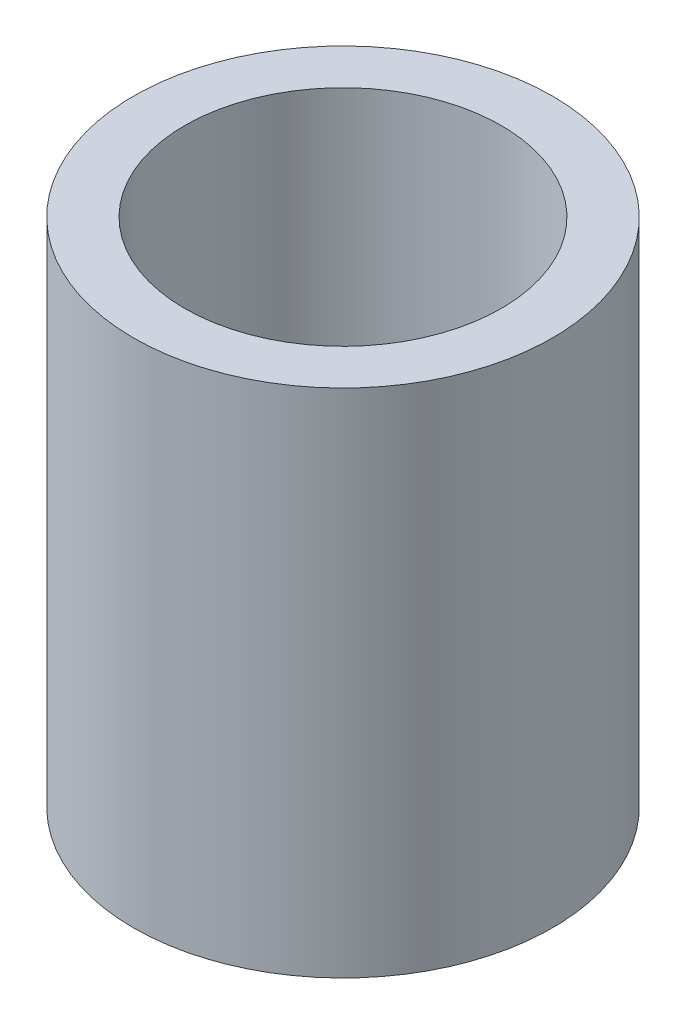
ISO-10303-21;
HEADER;
FILE_DESCRIPTION(('STEP AP214'),'2;1');
FILE_NAME('part.step','',(''),(''),'','','');
FILE_SCHEMA(('AUTOMOTIVE_DESIGN { 1 0 10303 214 1 1 1 1 }'));
ENDSEC;
DATA;
#1=APPLICATION_CONTEXT('core data for automotive mechanical design processes');
#2=APPLICATION_PROTOCOL_DEFINITION('international standard','automotive_design',2000,#1);
#3=PRODUCT_CONTEXT('',#1,'mechanical');
#4=PRODUCT('Part','Part','',(#3));
#5=PRODUCT_RELATED_PRODUCT_CATEGORY('part','',(#4));
#6=PRODUCT_DEFINITION_FORMATION('','',#4);
#7=PRODUCT_DEFINITION_CONTEXT('part definition',#1,'design');
#8=PRODUCT_DEFINITION('design','',#6,#7);
#9=PRODUCT_DEFINITION_SHAPE('','',#8);
#10=(LENGTH_UNIT() NAMED_UNIT(*) SI_UNIT(.MILLI.,.METRE.));
#11=(NAMED_UNIT(*) PLANE_ANGLE_UNIT() SI_UNIT($,.RADIAN.));
#12=(NAMED_UNIT(*) SI_UNIT($,.STERADIAN.) SOLID_ANGLE_UNIT());
#13=UNCERTAINTY_MEASURE_WITH_UNIT(LENGTH_MEASURE(1.E-05),#10,'distance_accuracy_value','');
#14=(GEOMETRIC_REPRESENTATION_CONTEXT(3) GLOBAL_UNCERTAINTY_ASSIGNED_CONTEXT((#13)) GLOBAL_UNIT_ASSIGNED_CONTEXT((#10,
#11,#12)) REPRESENTATION_CONTEXT('',''));
#15=CARTESIAN_POINT('',(0.,0.,0.));
#16=DIRECTION('',(0.,0.,1.));
#17=DIRECTION('',(1.,0.,0.));
#18=AXIS2_PLACEMENT_3D('',#15,#16,#17);
#19=CARTESIAN_POINT('',(0.,5.,0.));
#20=DIRECTION('',(0.,1.,0.));
#21=DIRECTION('',(0.,0.,1.));
#22=AXIS2_PLACEMENT_3D('',#19,#20,#21);
#23=PLANE('',#22);
#24=CARTESIAN_POINT('',(0.,5.,0.));
#25=DIRECTION('',(0.,1.,0.));
#26=DIRECTION('',(0.,0.,1.));
#27=AXIS2_PLACEMENT_3D('',#24,#25,#26);
#28=CIRCLE('',#27,2.05);
#29=CARTESIAN_POINT('',(0.,5.,2.05));
#30=VERTEX_POINT('',#29);
#31=EDGE_CURVE('E10',#30,#30,#28,.T.);
#32=ORIENTED_EDGE('',*,*,#31,.T.);
#33=EDGE_LOOP('',(#32));
#34=FACE_BOUND('',#33,.T.);
#35=CARTESIAN_POINT('',(0.,5.,0.));
#36=DIRECTION('',(0.,1.,0.));
#37=DIRECTION('',(0.,0.,1.));
#38=AXIS2_PLACEMENT_3D('',#35,#36,#37);
#39=CIRCLE('',#38,1.55);
#40=CARTESIAN_POINT('',(0.,5.,1.55));
#41=VERTEX_POINT('',#40);
#42=EDGE_CURVE('E50',#41,#41,#39,.T.);
#43=ORIENTED_EDGE('',*,*,#42,.F.);
#44=EDGE_LOOP('',(#43));
#45=FACE_BOUND('',#44,.T.);
#46=ADVANCED_FACE('F37',(#34,#45),#23,.T.);
#47=CARTESIAN_POINT('',(0.,0.,0.));
#48=DIRECTION('',(0.,1.,0.));
#49=DIRECTION('',(0.,0.,1.));
#50=AXIS2_PLACEMENT_3D('',#47,#48,#49);
#51=PLANE('',#50);
#52=CARTESIAN_POINT('',(0.,0.,0.));
#53=DIRECTION('',(0.,1.,0.));
#54=DIRECTION('',(0.,0.,1.));
#55=AXIS2_PLACEMENT_3D('',#52,#53,#54);
#56=CIRCLE('',#55,2.05);
#57=CARTESIAN_POINT('',(0.,0.,2.05));
#58=VERTEX_POINT('',#57);
#59=EDGE_CURVE('E41',#58,#58,#56,.T.);
#60=ORIENTED_EDGE('',*,*,#59,.F.);
#61=EDGE_LOOP('',(#60));
#62=FACE_BOUND('',#61,.T.);
#63=CARTESIAN_POINT('',(0.,0.,0.));
#64=DIRECTION('',(0.,1.,0.));
#65=DIRECTION('',(0.,0.,1.));
#66=AXIS2_PLACEMENT_3D('',#63,#64,#65);
#67=CIRCLE('',#66,1.55);
#68=CARTESIAN_POINT('',(0.,0.,1.55));
#69=VERTEX_POINT('',#68);
#70=EDGE_CURVE('E52',#69,#69,#67,.T.);
#71=ORIENTED_EDGE('',*,*,#70,.T.);
#72=EDGE_LOOP('',(#71));
#73=FACE_BOUND('',#72,.T.);
#74=ADVANCED_FACE('F64',(#62,#73),#51,.F.);
#75=CARTESIAN_POINT('',(0.,5.,0.));
#76=DIRECTION('',(0.,-1.,0.));
#77=DIRECTION('',(0.,0.,-1.));
#78=AXIS2_PLACEMENT_3D('',#75,#76,#77);
#79=CYLINDRICAL_SURFACE('',#78,2.05);
#80=ORIENTED_EDGE('',*,*,#31,.F.);
#81=EDGE_LOOP('',(#80));
#82=FACE_BOUND('',#81,.T.);
#83=ORIENTED_EDGE('',*,*,#59,.T.);
#84=EDGE_LOOP('',(#83));
#85=FACE_BOUND('',#84,.T.);
#86=ADVANCED_FACE('F39',(#82,#85),#79,.T.);
#87=CARTESIAN_POINT('',(0.,5.,0.));
#88=DIRECTION('',(0.,-1.,0.));
#89=DIRECTION('',(0.,0.,-1.));
#90=AXIS2_PLACEMENT_3D('',#87,#88,#89);
#91=CYLINDRICAL_SURFACE('',#90,1.55);
#92=ORIENTED_EDGE('',*,*,#42,.T.);
#93=EDGE_LOOP('',(#92));
#94=FACE_BOUND('',#93,.T.);
#95=ORIENTED_EDGE('',*,*,#70,.F.);
#96=EDGE_LOOP('',(#95));
#97=FACE_BOUND('',#96,.T.);
#98=ADVANCED_FACE('F60',(#94,#97),#91,.F.);
#99=CLOSED_SHELL('',(#46,#74,#86,#98));
#100=MANIFOLD_SOLID_BREP('B2',#99);
#101=ADVANCED_BREP_SHAPE_REPRESENTATION('',(#18,#100),#14);
#102=SHAPE_DEFINITION_REPRESENTATION(#9,#101);
ENDSEC;
END-ISO-10303-21;
